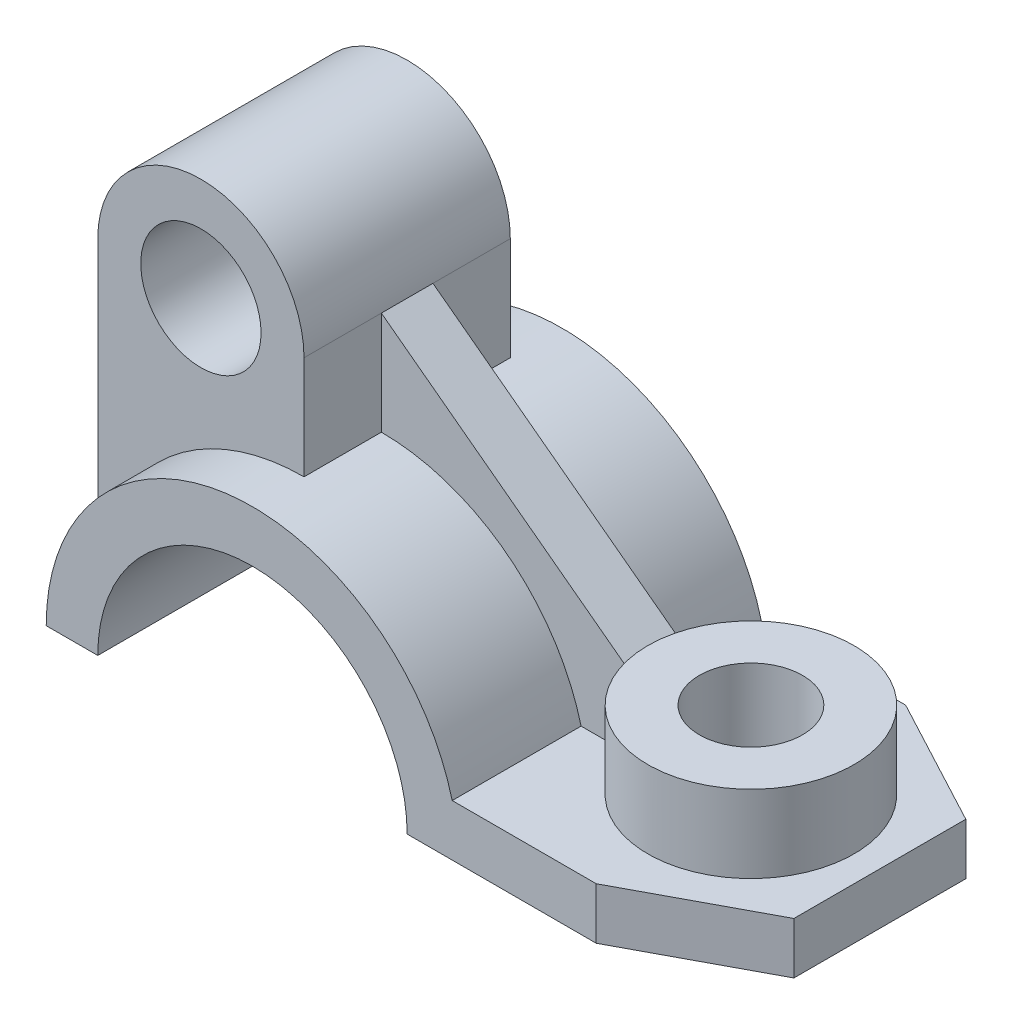
ISO-10303-21;
HEADER;
FILE_DESCRIPTION(('STEP AP214'),'2;1');
FILE_NAME('part.step','',(''),(''),'','','');
FILE_SCHEMA(('AUTOMOTIVE_DESIGN { 1 0 10303 214 1 1 1 1 }'));
ENDSEC;
DATA;
#1=APPLICATION_CONTEXT('core data for automotive mechanical design processes');
#2=APPLICATION_PROTOCOL_DEFINITION('international standard','automotive_design',2000,#1);
#3=PRODUCT_CONTEXT('',#1,'mechanical');
#4=PRODUCT('Part','Part','',(#3));
#5=PRODUCT_RELATED_PRODUCT_CATEGORY('part','',(#4));
#6=PRODUCT_DEFINITION_FORMATION('','',#4);
#7=PRODUCT_DEFINITION_CONTEXT('part definition',#1,'design');
#8=PRODUCT_DEFINITION('design','',#6,#7);
#9=PRODUCT_DEFINITION_SHAPE('','',#8);
#10=(LENGTH_UNIT() NAMED_UNIT(*) SI_UNIT(.MILLI.,.METRE.));
#11=(NAMED_UNIT(*) PLANE_ANGLE_UNIT() SI_UNIT($,.RADIAN.));
#12=(NAMED_UNIT(*) SI_UNIT($,.STERADIAN.) SOLID_ANGLE_UNIT());
#13=UNCERTAINTY_MEASURE_WITH_UNIT(LENGTH_MEASURE(1.E-05),#10,'distance_accuracy_value','');
#14=(GEOMETRIC_REPRESENTATION_CONTEXT(3) GLOBAL_UNCERTAINTY_ASSIGNED_CONTEXT((#13)) GLOBAL_UNIT_ASSIGNED_CONTEXT((#10,
#11,#12)) REPRESENTATION_CONTEXT('',''));
#15=CARTESIAN_POINT('',(0.,0.,0.));
#16=DIRECTION('',(0.,0.,1.));
#17=DIRECTION('',(1.,0.,0.));
#18=AXIS2_PLACEMENT_3D('',#15,#16,#17);
#19=CARTESIAN_POINT('',(0.,0.,18.));
#20=DIRECTION('',(0.,0.,-1.));
#21=DIRECTION('',(-1.,0.,0.));
#22=AXIS2_PLACEMENT_3D('',#19,#20,#21);
#23=CYLINDRICAL_SURFACE('',#22,24.);
#24=CARTESIAN_POINT('',(0.,0.,-3.));
#25=DIRECTION('',(0.,0.,1.));
#26=DIRECTION('',(1.,0.,0.));
#27=AXIS2_PLACEMENT_3D('',#24,#25,#26);
#28=CIRCLE('',#27,24.);
#29=CARTESIAN_POINT('',(23.2379000772445,5.99999999999999,-3.));
#30=VERTEX_POINT('',#29);
#31=CARTESIAN_POINT('',(0.,24.,-3.));
#32=VERTEX_POINT('',#31);
#33=EDGE_CURVE('E184',#30,#32,#28,.T.);
#34=ORIENTED_EDGE('',*,*,#33,.F.);
#35=DIRECTION('',(0.,0.,-1.));
#36=VECTOR('',#35,1.);
#37=CARTESIAN_POINT('',(23.2379000772445,5.99999999999999,18.));
#38=LINE('',#37,#36);
#39=CARTESIAN_POINT('',(23.2379000772445,5.99999999999999,-18.));
#40=VERTEX_POINT('',#39);
#41=EDGE_CURVE('E181',#30,#40,#38,.T.);
#42=ORIENTED_EDGE('',*,*,#41,.T.);
#43=CARTESIAN_POINT('',(0.,0.,-18.));
#44=DIRECTION('',(0.,0.,1.));
#45=DIRECTION('',(1.,0.,0.));
#46=AXIS2_PLACEMENT_3D('',#43,#44,#45);
#47=CIRCLE('',#46,24.);
#48=CARTESIAN_POINT('',(-24.,0.,-18.));
#49=VERTEX_POINT('',#48);
#50=EDGE_CURVE('E279',#40,#49,#47,.T.);
#51=ORIENTED_EDGE('',*,*,#50,.T.);
#52=DIRECTION('',(0.,0.,-1.));
#53=VECTOR('',#52,1.);
#54=CARTESIAN_POINT('',(-24.,0.,18.));
#55=LINE('',#54,#53);
#56=CARTESIAN_POINT('',(-24.,0.,-12.));
#57=VERTEX_POINT('',#56);
#58=EDGE_CURVE('E290',#57,#49,#55,.T.);
#59=ORIENTED_EDGE('',*,*,#58,.F.);
#60=CARTESIAN_POINT('',(0.,0.,-12.));
#61=DIRECTION('',(0.,0.,1.));
#62=DIRECTION('',(1.,0.,0.));
#63=AXIS2_PLACEMENT_3D('',#60,#61,#62);
#64=CIRCLE('',#63,24.);
#65=CARTESIAN_POINT('',(0.,24.,-12.));
#66=VERTEX_POINT('',#65);
#67=EDGE_CURVE('E246',#66,#57,#64,.T.);
#68=ORIENTED_EDGE('',*,*,#67,.F.);
#69=DIRECTION('',(0.,0.,-1.));
#70=VECTOR('',#69,1.);
#71=CARTESIAN_POINT('',(0.,24.,12.));
#72=LINE('',#71,#70);
#73=EDGE_CURVE('E254',#32,#66,#72,.T.);
#74=ORIENTED_EDGE('',*,*,#73,.F.);
#75=EDGE_LOOP('',(#34,#42,#51,#59,#68,#74));
#76=FACE_BOUND('',#75,.T.);
#77=ADVANCED_FACE('F43',(#76),#23,.T.);
#78=CARTESIAN_POINT('',(0.,0.,12.));
#79=DIRECTION('',(1.,0.,0.));
#80=DIRECTION('',(0.,1.,0.));
#81=AXIS2_PLACEMENT_3D('',#78,#79,#80);
#82=PLANE('',#81);
#83=DIRECTION('',(0.,0.,-1.));
#84=VECTOR('',#83,1.);
#85=CARTESIAN_POINT('',(0.,36.,12.));
#86=LINE('',#85,#84);
#87=CARTESIAN_POINT('',(0.,36.,-3.));
#88=VERTEX_POINT('',#87);
#89=CARTESIAN_POINT('',(0.,36.,-12.));
#90=VERTEX_POINT('',#89);
#91=EDGE_CURVE('E237',#88,#90,#86,.T.);
#92=ORIENTED_EDGE('',*,*,#91,.F.);
#93=DIRECTION('',(0.,-1.,0.));
#94=VECTOR('',#93,1.);
#95=CARTESIAN_POINT('',(0.,0.,-3.));
#96=LINE('',#95,#94);
#97=EDGE_CURVE('E198',#88,#32,#96,.T.);
#98=ORIENTED_EDGE('',*,*,#97,.T.);
#99=ORIENTED_EDGE('',*,*,#73,.T.);
#100=DIRECTION('',(0.,-1.,0.));
#101=VECTOR('',#100,1.);
#102=CARTESIAN_POINT('',(0.,0.,-12.));
#103=LINE('',#102,#101);
#104=EDGE_CURVE('E225',#90,#66,#103,.T.);
#105=ORIENTED_EDGE('',*,*,#104,.F.);
#106=EDGE_LOOP('',(#92,#98,#99,#105));
#107=FACE_BOUND('',#106,.T.);
#108=ADVANCED_FACE('F338',(#107),#82,.T.);
#109=CARTESIAN_POINT('',(0.,0.,18.));
#110=DIRECTION('',(0.,1.,0.));
#111=DIRECTION('',(0.,0.,1.));
#112=AXIS2_PLACEMENT_3D('',#109,#110,#111);
#113=PLANE('',#112);
#114=CARTESIAN_POINT('',(40.,0.,0.));
#115=DIRECTION('',(0.,1.,0.));
#116=DIRECTION('',(-1.,0.,0.));
#117=AXIS2_PLACEMENT_3D('',#114,#115,#116);
#118=CIRCLE('',#117,6.);
#119=CARTESIAN_POINT('',(34.,0.,0.));
#120=VERTEX_POINT('',#119);
#121=EDGE_CURVE('E376',#120,#120,#118,.T.);
#122=ORIENTED_EDGE('',*,*,#121,.T.);
#123=EDGE_LOOP('',(#122));
#124=FACE_BOUND('',#123,.T.);
#125=DIRECTION('',(1.,0.,0.));
#126=VECTOR('',#125,1.);
#127=CARTESIAN_POINT('',(0.,0.,-18.));
#128=LINE('',#127,#126);
#129=CARTESIAN_POINT('',(18.,0.,-18.));
#130=VERTEX_POINT('',#129);
#131=CARTESIAN_POINT('',(39.9999999999999,0.,-18.));
#132=VERTEX_POINT('',#131);
#133=EDGE_CURVE('E262',#130,#132,#128,.T.);
#134=ORIENTED_EDGE('',*,*,#133,.T.);
#135=DIRECTION('',(-0.882352941176472,0.,-0.470588235294116));
#136=VECTOR('',#135,1.);
#137=CARTESIAN_POINT('',(55.,0.,-9.99999999999999));
#138=LINE('',#137,#136);
#139=CARTESIAN_POINT('',(55.,0.,-9.99999999999999));
#140=VERTEX_POINT('',#139);
#141=EDGE_CURVE('E11',#132,#140,#138,.F.);
#142=ORIENTED_EDGE('',*,*,#141,.T.);
#143=DIRECTION('',(0.,0.,-1.));
#144=VECTOR('',#143,1.);
#145=CARTESIAN_POINT('',(55.,0.,18.));
#146=LINE('',#145,#144);
#147=CARTESIAN_POINT('',(55.,0.,9.99999999999999));
#148=VERTEX_POINT('',#147);
#149=EDGE_CURVE('E174',#148,#140,#146,.T.);
#150=ORIENTED_EDGE('',*,*,#149,.F.);
#151=DIRECTION('',(-0.882352941176472,0.,0.470588235294116));
#152=VECTOR('',#151,1.);
#153=CARTESIAN_POINT('',(39.9999999999999,0.,18.));
#154=LINE('',#153,#152);
#155=CARTESIAN_POINT('',(39.9999999999999,0.,18.));
#156=VERTEX_POINT('',#155);
#157=EDGE_CURVE('E307',#148,#156,#154,.T.);
#158=ORIENTED_EDGE('',*,*,#157,.T.);
#159=DIRECTION('',(1.,0.,0.));
#160=VECTOR('',#159,1.);
#161=CARTESIAN_POINT('',(0.,0.,18.));
#162=LINE('',#161,#160);
#163=CARTESIAN_POINT('',(18.,0.,18.));
#164=VERTEX_POINT('',#163);
#165=EDGE_CURVE('E263',#164,#156,#162,.T.);
#166=ORIENTED_EDGE('',*,*,#165,.F.);
#167=DIRECTION('',(0.,0.,-1.));
#168=VECTOR('',#167,1.);
#169=CARTESIAN_POINT('',(18.,0.,18.));
#170=LINE('',#169,#168);
#171=EDGE_CURVE('E275',#164,#130,#170,.T.);
#172=ORIENTED_EDGE('',*,*,#171,.T.);
#173=EDGE_LOOP('',(#134,#142,#150,#158,#166,#172));
#174=FACE_BOUND('',#173,.T.);
#175=ADVANCED_FACE('F332',(#124,#174),#113,.F.);
#176=CARTESIAN_POINT('',(55.,0.,18.));
#177=DIRECTION('',(-1.,0.,0.));
#178=DIRECTION('',(0.,0.,1.));
#179=AXIS2_PLACEMENT_3D('',#176,#177,#178);
#180=PLANE('',#179);
#181=ORIENTED_EDGE('',*,*,#149,.T.);
#182=DIRECTION('',(0.,1.,0.));
#183=VECTOR('',#182,1.);
#184=CARTESIAN_POINT('',(55.,0.,-9.99999999999999));
#185=LINE('',#184,#183);
#186=CARTESIAN_POINT('',(55.,6.,-9.99999999999999));
#187=VERTEX_POINT('',#186);
#188=EDGE_CURVE('E309',#140,#187,#185,.T.);
#189=ORIENTED_EDGE('',*,*,#188,.T.);
#190=DIRECTION('',(0.,0.,-1.));
#191=VECTOR('',#190,1.);
#192=CARTESIAN_POINT('',(55.,6.,18.));
#193=LINE('',#192,#191);
#194=CARTESIAN_POINT('',(55.,6.,9.99999999999999));
#195=VERTEX_POINT('',#194);
#196=EDGE_CURVE('E297',#195,#187,#193,.T.);
#197=ORIENTED_EDGE('',*,*,#196,.F.);
#198=DIRECTION('',(0.,-1.,0.));
#199=VECTOR('',#198,1.);
#200=CARTESIAN_POINT('',(55.,0.,9.99999999999999));
#201=LINE('',#200,#199);
#202=EDGE_CURVE('E305',#195,#148,#201,.T.);
#203=ORIENTED_EDGE('',*,*,#202,.T.);
#204=EDGE_LOOP('',(#181,#189,#197,#203));
#205=FACE_BOUND('',#204,.T.);
#206=ADVANCED_FACE('F315',(#205),#180,.F.);
#207=CARTESIAN_POINT('',(0.,5.99999999999999,18.));
#208=DIRECTION('',(0.,-1.,0.));
#209=DIRECTION('',(1.,0.,0.));
#210=AXIS2_PLACEMENT_3D('',#207,#208,#209);
#211=PLANE('',#210);
#212=ORIENTED_EDGE('',*,*,#196,.T.);
#213=DIRECTION('',(0.882352941176472,0.,0.470588235294116));
#214=VECTOR('',#213,1.);
#215=CARTESIAN_POINT('',(55.,6.,-9.99999999999999));
#216=LINE('',#215,#214);
#217=CARTESIAN_POINT('',(39.9999999999999,6.,-18.));
#218=VERTEX_POINT('',#217);
#219=EDGE_CURVE('E66',#187,#218,#216,.F.);
#220=ORIENTED_EDGE('',*,*,#219,.T.);
#221=DIRECTION('',(-1.,0.,0.));
#222=VECTOR('',#221,1.);
#223=CARTESIAN_POINT('',(0.,5.99999999999999,-18.));
#224=LINE('',#223,#222);
#225=EDGE_CURVE('E277',#218,#40,#224,.T.);
#226=ORIENTED_EDGE('',*,*,#225,.T.);
#227=ORIENTED_EDGE('',*,*,#41,.F.);
#228=DIRECTION('',(-1.,0.,0.));
#229=VECTOR('',#228,1.);
#230=CARTESIAN_POINT('',(0.,5.99999999999999,-3.));
#231=LINE('',#230,#229);
#232=CARTESIAN_POINT('',(28.3810499613778,6.,-3.));
#233=VERTEX_POINT('',#232);
#234=EDGE_CURVE('E178',#233,#30,#231,.T.);
#235=ORIENTED_EDGE('',*,*,#234,.F.);
#236=CARTESIAN_POINT('',(40.,6.,0.));
#237=DIRECTION('',(0.,-1.,0.));
#238=DIRECTION('',(1.,0.,0.));
#239=AXIS2_PLACEMENT_3D('',#236,#237,#238);
#240=CIRCLE('',#239,12.);
#241=CARTESIAN_POINT('',(28.3810499613778,6.,3.));
#242=VERTEX_POINT('',#241);
#243=EDGE_CURVE('E164',#242,#233,#240,.F.);
#244=ORIENTED_EDGE('',*,*,#243,.F.);
#245=DIRECTION('',(-1.,0.,0.));
#246=VECTOR('',#245,1.);
#247=CARTESIAN_POINT('',(0.,5.99999999999999,3.));
#248=LINE('',#247,#246);
#249=CARTESIAN_POINT('',(23.2379000772445,5.99999999999999,3.));
#250=VERTEX_POINT('',#249);
#251=EDGE_CURVE('E201',#242,#250,#248,.T.);
#252=ORIENTED_EDGE('',*,*,#251,.T.);
#253=CARTESIAN_POINT('',(23.2379000772445,5.99999999999999,18.));
#254=VERTEX_POINT('',#253);
#255=EDGE_CURVE('E294',#254,#250,#38,.T.);
#256=ORIENTED_EDGE('',*,*,#255,.F.);
#257=DIRECTION('',(-1.,0.,0.));
#258=VECTOR('',#257,1.);
#259=CARTESIAN_POINT('',(0.,5.99999999999999,18.));
#260=LINE('',#259,#258);
#261=CARTESIAN_POINT('',(39.9999999999999,6.,18.));
#262=VERTEX_POINT('',#261);
#263=EDGE_CURVE('E266',#262,#254,#260,.T.);
#264=ORIENTED_EDGE('',*,*,#263,.F.);
#265=DIRECTION('',(0.882352941176472,0.,-0.470588235294116));
#266=VECTOR('',#265,1.);
#267=CARTESIAN_POINT('',(39.9999999999999,6.,18.));
#268=LINE('',#267,#266);
#269=EDGE_CURVE('E303',#262,#195,#268,.T.);
#270=ORIENTED_EDGE('',*,*,#269,.T.);
#271=EDGE_LOOP('',(#212,#220,#226,#227,#235,#244,#252,#256,#264,#270));
#272=FACE_BOUND('',#271,.T.);
#273=ADVANCED_FACE('F179',(#272),#211,.F.);
#274=ORIENTED_EDGE('',*,*,#255,.T.);
#275=CARTESIAN_POINT('',(0.,0.,3.));
#276=DIRECTION('',(0.,0.,1.));
#277=DIRECTION('',(1.,0.,0.));
#278=AXIS2_PLACEMENT_3D('',#275,#276,#277);
#279=CIRCLE('',#278,24.);
#280=CARTESIAN_POINT('',(0.,24.,3.));
#281=VERTEX_POINT('',#280);
#282=EDGE_CURVE('E203',#250,#281,#279,.T.);
#283=ORIENTED_EDGE('',*,*,#282,.T.);
#284=CARTESIAN_POINT('',(0.,24.,12.));
#285=VERTEX_POINT('',#284);
#286=EDGE_CURVE('E255',#285,#281,#72,.T.);
#287=ORIENTED_EDGE('',*,*,#286,.F.);
#288=CARTESIAN_POINT('',(0.,0.,12.));
#289=DIRECTION('',(0.,0.,1.));
#290=DIRECTION('',(1.,0.,0.));
#291=AXIS2_PLACEMENT_3D('',#288,#289,#290);
#292=CIRCLE('',#291,24.);
#293=CARTESIAN_POINT('',(-24.,0.,12.));
#294=VERTEX_POINT('',#293);
#295=EDGE_CURVE('E231',#285,#294,#292,.T.);
#296=ORIENTED_EDGE('',*,*,#295,.T.);
#297=CARTESIAN_POINT('',(-24.,0.,18.));
#298=VERTEX_POINT('',#297);
#299=EDGE_CURVE('E291',#298,#294,#55,.T.);
#300=ORIENTED_EDGE('',*,*,#299,.F.);
#301=CARTESIAN_POINT('',(0.,0.,18.));
#302=DIRECTION('',(0.,0.,1.));
#303=DIRECTION('',(1.,0.,0.));
#304=AXIS2_PLACEMENT_3D('',#301,#302,#303);
#305=CIRCLE('',#304,24.);
#306=EDGE_CURVE('E269',#254,#298,#305,.T.);
#307=ORIENTED_EDGE('',*,*,#306,.F.);
#308=EDGE_LOOP('',(#274,#283,#287,#296,#300,#307));
#309=FACE_BOUND('',#308,.T.);
#310=ADVANCED_FACE('F341',(#309),#23,.T.);
#311=CARTESIAN_POINT('',(0.,0.,18.));
#312=DIRECTION('',(0.,1.,0.));
#313=DIRECTION('',(0.,0.,1.));
#314=AXIS2_PLACEMENT_3D('',#311,#312,#313);
#315=PLANE('',#314);
#316=DIRECTION('',(0.,0.,-1.));
#317=VECTOR('',#316,1.);
#318=CARTESIAN_POINT('',(-24.,0.,12.));
#319=LINE('',#318,#317);
#320=EDGE_CURVE('E258',#294,#57,#319,.T.);
#321=ORIENTED_EDGE('',*,*,#320,.T.);
#322=ORIENTED_EDGE('',*,*,#58,.T.);
#323=DIRECTION('',(1.,0.,0.));
#324=VECTOR('',#323,1.);
#325=CARTESIAN_POINT('',(0.,0.,-18.));
#326=LINE('',#325,#324);
#327=CARTESIAN_POINT('',(-18.,0.,-18.));
#328=VERTEX_POINT('',#327);
#329=EDGE_CURVE('E282',#49,#328,#326,.T.);
#330=ORIENTED_EDGE('',*,*,#329,.T.);
#331=DIRECTION('',(0.,0.,-1.));
#332=VECTOR('',#331,1.);
#333=CARTESIAN_POINT('',(-18.,0.,18.));
#334=LINE('',#333,#332);
#335=CARTESIAN_POINT('',(-18.,0.,18.));
#336=VERTEX_POINT('',#335);
#337=EDGE_CURVE('E288',#336,#328,#334,.T.);
#338=ORIENTED_EDGE('',*,*,#337,.F.);
#339=DIRECTION('',(1.,0.,0.));
#340=VECTOR('',#339,1.);
#341=CARTESIAN_POINT('',(0.,0.,18.));
#342=LINE('',#341,#340);
#343=EDGE_CURVE('E271',#298,#336,#342,.T.);
#344=ORIENTED_EDGE('',*,*,#343,.F.);
#345=ORIENTED_EDGE('',*,*,#299,.T.);
#346=EDGE_LOOP('',(#321,#322,#330,#338,#344,#345));
#347=FACE_BOUND('',#346,.T.);
#348=ADVANCED_FACE('F351',(#347),#315,.F.);
#349=CARTESIAN_POINT('',(0.,0.,18.));
#350=DIRECTION('',(0.,0.,-1.));
#351=DIRECTION('',(-1.,0.,0.));
#352=AXIS2_PLACEMENT_3D('',#349,#350,#351);
#353=CYLINDRICAL_SURFACE('',#352,18.);
#354=ORIENTED_EDGE('',*,*,#337,.T.);
#355=CARTESIAN_POINT('',(0.,0.,-18.));
#356=DIRECTION('',(0.,0.,1.));
#357=DIRECTION('',(1.,0.,0.));
#358=AXIS2_PLACEMENT_3D('',#355,#356,#357);
#359=CIRCLE('',#358,18.);
#360=EDGE_CURVE('E267',#328,#130,#359,.F.);
#361=ORIENTED_EDGE('',*,*,#360,.T.);
#362=ORIENTED_EDGE('',*,*,#171,.F.);
#363=CARTESIAN_POINT('',(0.,0.,18.));
#364=DIRECTION('',(0.,0.,1.));
#365=DIRECTION('',(1.,0.,0.));
#366=AXIS2_PLACEMENT_3D('',#363,#364,#365);
#367=CIRCLE('',#366,18.);
#368=EDGE_CURVE('E273',#336,#164,#367,.F.);
#369=ORIENTED_EDGE('',*,*,#368,.F.);
#370=EDGE_LOOP('',(#354,#361,#362,#369));
#371=FACE_BOUND('',#370,.T.);
#372=ADVANCED_FACE('F357',(#371),#353,.F.);
#373=CARTESIAN_POINT('',(0.,0.,18.));
#374=DIRECTION('',(0.,0.,1.));
#375=DIRECTION('',(1.,0.,0.));
#376=AXIS2_PLACEMENT_3D('',#373,#374,#375);
#377=PLANE('',#376);
#378=ORIENTED_EDGE('',*,*,#165,.T.);
#379=DIRECTION('',(0.,1.,0.));
#380=VECTOR('',#379,1.);
#381=CARTESIAN_POINT('',(39.9999999999999,6.,18.));
#382=LINE('',#381,#380);
#383=EDGE_CURVE('E173',#156,#262,#382,.T.);
#384=ORIENTED_EDGE('',*,*,#383,.T.);
#385=ORIENTED_EDGE('',*,*,#263,.T.);
#386=ORIENTED_EDGE('',*,*,#306,.T.);
#387=ORIENTED_EDGE('',*,*,#343,.T.);
#388=ORIENTED_EDGE('',*,*,#368,.T.);
#389=EDGE_LOOP('',(#378,#384,#385,#386,#387,#388));
#390=FACE_BOUND('',#389,.T.);
#391=ADVANCED_FACE('F327',(#390),#377,.T.);
#392=CARTESIAN_POINT('',(0.,0.,-18.));
#393=DIRECTION('',(0.,0.,1.));
#394=DIRECTION('',(1.,0.,0.));
#395=AXIS2_PLACEMENT_3D('',#392,#393,#394);
#396=PLANE('',#395);
#397=ORIENTED_EDGE('',*,*,#225,.F.);
#398=DIRECTION('',(0.,-1.,0.));
#399=VECTOR('',#398,1.);
#400=CARTESIAN_POINT('',(39.9999999999999,0.,-18.));
#401=LINE('',#400,#399);
#402=EDGE_CURVE('E52',#218,#132,#401,.T.);
#403=ORIENTED_EDGE('',*,*,#402,.T.);
#404=ORIENTED_EDGE('',*,*,#133,.F.);
#405=ORIENTED_EDGE('',*,*,#360,.F.);
#406=ORIENTED_EDGE('',*,*,#329,.F.);
#407=ORIENTED_EDGE('',*,*,#50,.F.);
#408=EDGE_LOOP('',(#397,#403,#404,#405,#406,#407));
#409=FACE_BOUND('',#408,.T.);
#410=ADVANCED_FACE('F414',(#409),#396,.F.);
#411=CARTESIAN_POINT('',(-12.,36.,12.));
#412=DIRECTION('',(0.,0.,-1.));
#413=DIRECTION('',(-1.,0.,0.));
#414=AXIS2_PLACEMENT_3D('',#411,#412,#413);
#415=CYLINDRICAL_SURFACE('',#414,12.);
#416=CARTESIAN_POINT('',(-12.,36.,-12.));
#417=DIRECTION('',(0.,0.,1.));
#418=DIRECTION('',(1.,0.,0.));
#419=AXIS2_PLACEMENT_3D('',#416,#417,#418);
#420=CIRCLE('',#419,12.);
#421=CARTESIAN_POINT('',(-24.,36.,-12.));
#422=VERTEX_POINT('',#421);
#423=EDGE_CURVE('E240',#422,#90,#420,.F.);
#424=ORIENTED_EDGE('',*,*,#423,.F.);
#425=DIRECTION('',(0.,0.,-1.));
#426=VECTOR('',#425,1.);
#427=CARTESIAN_POINT('',(-24.,36.,12.));
#428=LINE('',#427,#426);
#429=CARTESIAN_POINT('',(-24.,36.,12.));
#430=VERTEX_POINT('',#429);
#431=EDGE_CURVE('E260',#430,#422,#428,.T.);
#432=ORIENTED_EDGE('',*,*,#431,.F.);
#433=CARTESIAN_POINT('',(-12.,36.,12.));
#434=DIRECTION('',(0.,0.,1.));
#435=DIRECTION('',(1.,0.,0.));
#436=AXIS2_PLACEMENT_3D('',#433,#434,#435);
#437=CIRCLE('',#436,12.);
#438=CARTESIAN_POINT('',(0.,36.,12.));
#439=VERTEX_POINT('',#438);
#440=EDGE_CURVE('E224',#430,#439,#437,.F.);
#441=ORIENTED_EDGE('',*,*,#440,.T.);
#442=CARTESIAN_POINT('',(0.,36.,3.));
#443=VERTEX_POINT('',#442);
#444=EDGE_CURVE('E251',#439,#443,#86,.T.);
#445=ORIENTED_EDGE('',*,*,#444,.T.);
#446=DIRECTION('',(0.,0.,-1.));
#447=VECTOR('',#446,1.);
#448=CARTESIAN_POINT('',(0.,36.,12.));
#449=LINE('',#448,#447);
#450=EDGE_CURVE('E211',#88,#443,#449,.F.);
#451=ORIENTED_EDGE('',*,*,#450,.F.);
#452=ORIENTED_EDGE('',*,*,#91,.T.);
#453=EDGE_LOOP('',(#424,#432,#441,#445,#451,#452));
#454=FACE_BOUND('',#453,.T.);
#455=ADVANCED_FACE('F370',(#454),#415,.T.);
#456=CARTESIAN_POINT('',(-24.,0.,12.));
#457=DIRECTION('',(-1.,0.,0.));
#458=DIRECTION('',(0.,0.,1.));
#459=AXIS2_PLACEMENT_3D('',#456,#457,#458);
#460=PLANE('',#459);
#461=ORIENTED_EDGE('',*,*,#431,.T.);
#462=DIRECTION('',(0.,1.,0.));
#463=VECTOR('',#462,1.);
#464=CARTESIAN_POINT('',(-24.,0.,-12.));
#465=LINE('',#464,#463);
#466=EDGE_CURVE('E243',#57,#422,#465,.T.);
#467=ORIENTED_EDGE('',*,*,#466,.F.);
#468=ORIENTED_EDGE('',*,*,#320,.F.);
#469=DIRECTION('',(0.,1.,0.));
#470=VECTOR('',#469,1.);
#471=CARTESIAN_POINT('',(-24.,0.,12.));
#472=LINE('',#471,#470);
#473=EDGE_CURVE('E228',#294,#430,#472,.T.);
#474=ORIENTED_EDGE('',*,*,#473,.T.);
#475=EDGE_LOOP('',(#461,#467,#468,#474));
#476=FACE_BOUND('',#475,.T.);
#477=ADVANCED_FACE('F408',(#476),#460,.T.);
#478=CARTESIAN_POINT('',(-12.,36.,12.));
#479=DIRECTION('',(0.,0.,-1.));
#480=DIRECTION('',(-1.,0.,0.));
#481=AXIS2_PLACEMENT_3D('',#478,#479,#480);
#482=CYLINDRICAL_SURFACE('',#481,7.);
#483=CARTESIAN_POINT('',(-12.,36.,12.));
#484=DIRECTION('',(0.,0.,1.));
#485=DIRECTION('',(1.,0.,0.));
#486=AXIS2_PLACEMENT_3D('',#483,#484,#485);
#487=CIRCLE('',#486,7.);
#488=CARTESIAN_POINT('',(-5.,36.,12.));
#489=VERTEX_POINT('',#488);
#490=EDGE_CURVE('E221',#489,#489,#487,.T.);
#491=ORIENTED_EDGE('',*,*,#490,.T.);
#492=EDGE_LOOP('',(#491));
#493=FACE_BOUND('',#492,.T.);
#494=CARTESIAN_POINT('',(-12.,36.,-12.));
#495=DIRECTION('',(0.,0.,1.));
#496=DIRECTION('',(1.,0.,0.));
#497=AXIS2_PLACEMENT_3D('',#494,#495,#496);
#498=CIRCLE('',#497,7.);
#499=CARTESIAN_POINT('',(-5.,36.,-12.));
#500=VERTEX_POINT('',#499);
#501=EDGE_CURVE('E220',#500,#500,#498,.T.);
#502=ORIENTED_EDGE('',*,*,#501,.F.);
#503=EDGE_LOOP('',(#502));
#504=FACE_BOUND('',#503,.T.);
#505=ADVANCED_FACE('F407',(#493,#504),#482,.F.);
#506=DIRECTION('',(0.,-1.,0.));
#507=VECTOR('',#506,1.);
#508=CARTESIAN_POINT('',(0.,0.,3.));
#509=LINE('',#508,#507);
#510=EDGE_CURVE('E205',#443,#281,#509,.T.);
#511=ORIENTED_EDGE('',*,*,#510,.F.);
#512=ORIENTED_EDGE('',*,*,#444,.F.);
#513=DIRECTION('',(0.,-1.,0.));
#514=VECTOR('',#513,1.);
#515=CARTESIAN_POINT('',(0.,0.,12.));
#516=LINE('',#515,#514);
#517=EDGE_CURVE('E234',#439,#285,#516,.T.);
#518=ORIENTED_EDGE('',*,*,#517,.T.);
#519=ORIENTED_EDGE('',*,*,#286,.T.);
#520=EDGE_LOOP('',(#511,#512,#518,#519));
#521=FACE_BOUND('',#520,.T.);
#522=ADVANCED_FACE('F347',(#521),#82,.T.);
#523=CARTESIAN_POINT('',(0.,0.,12.));
#524=DIRECTION('',(0.,0.,1.));
#525=DIRECTION('',(1.,0.,0.));
#526=AXIS2_PLACEMENT_3D('',#523,#524,#525);
#527=PLANE('',#526);
#528=ORIENTED_EDGE('',*,*,#490,.F.);
#529=EDGE_LOOP('',(#528));
#530=FACE_BOUND('',#529,.T.);
#531=ORIENTED_EDGE('',*,*,#440,.F.);
#532=ORIENTED_EDGE('',*,*,#473,.F.);
#533=ORIENTED_EDGE('',*,*,#295,.F.);
#534=ORIENTED_EDGE('',*,*,#517,.F.);
#535=EDGE_LOOP('',(#531,#532,#533,#534));
#536=FACE_BOUND('',#535,.T.);
#537=ADVANCED_FACE('F399',(#530,#536),#527,.T.);
#538=CARTESIAN_POINT('',(0.,0.,-12.));
#539=DIRECTION('',(0.,0.,1.));
#540=DIRECTION('',(1.,0.,0.));
#541=AXIS2_PLACEMENT_3D('',#538,#539,#540);
#542=PLANE('',#541);
#543=ORIENTED_EDGE('',*,*,#501,.T.);
#544=EDGE_LOOP('',(#543));
#545=FACE_BOUND('',#544,.T.);
#546=ORIENTED_EDGE('',*,*,#423,.T.);
#547=ORIENTED_EDGE('',*,*,#104,.T.);
#548=ORIENTED_EDGE('',*,*,#67,.T.);
#549=ORIENTED_EDGE('',*,*,#466,.T.);
#550=EDGE_LOOP('',(#546,#547,#548,#549));
#551=FACE_BOUND('',#550,.T.);
#552=ADVANCED_FACE('F396',(#545,#551),#542,.F.);
#553=CARTESIAN_POINT('',(40.,15.,0.));
#554=DIRECTION('',(0.,1.,0.));
#555=DIRECTION('',(-1.,0.,0.));
#556=AXIS2_PLACEMENT_3D('',#553,#554,#555);
#557=PLANE('',#556);
#558=CARTESIAN_POINT('',(40.,15.,0.));
#559=DIRECTION('',(0.,1.,0.));
#560=DIRECTION('',(-1.,0.,0.));
#561=AXIS2_PLACEMENT_3D('',#558,#559,#560);
#562=CIRCLE('',#561,12.);
#563=CARTESIAN_POINT('',(28.,15.,0.));
#564=VERTEX_POINT('',#563);
#565=EDGE_CURVE('E217',#564,#564,#562,.T.);
#566=ORIENTED_EDGE('',*,*,#565,.T.);
#567=EDGE_LOOP('',(#566));
#568=FACE_BOUND('',#567,.T.);
#569=CARTESIAN_POINT('',(40.,15.,0.));
#570=DIRECTION('',(0.,1.,0.));
#571=DIRECTION('',(-1.,0.,0.));
#572=AXIS2_PLACEMENT_3D('',#569,#570,#571);
#573=CIRCLE('',#572,6.);
#574=CARTESIAN_POINT('',(34.,15.,0.));
#575=VERTEX_POINT('',#574);
#576=EDGE_CURVE('E214',#575,#575,#573,.T.);
#577=ORIENTED_EDGE('',*,*,#576,.F.);
#578=EDGE_LOOP('',(#577));
#579=FACE_BOUND('',#578,.T.);
#580=ADVANCED_FACE('F391',(#568,#579),#557,.T.);
#581=CARTESIAN_POINT('',(40.,15.,0.));
#582=DIRECTION('',(0.,-1.,0.));
#583=DIRECTION('',(1.,0.,0.));
#584=AXIS2_PLACEMENT_3D('',#581,#582,#583);
#585=CYLINDRICAL_SURFACE('',#584,12.);
#586=CARTESIAN_POINT('',(40.,5.99999999999999,0.));
#587=DIRECTION('',(-0.6,-0.8,0.));
#588=DIRECTION('',(0.8,-0.6,0.));
#589=AXIS2_PLACEMENT_3D('',#586,#587,#588);
#590=ELLIPSE('',#589,15.,12.);
#591=CARTESIAN_POINT('',(28.3810499613778,14.7142125289667,3.));
#592=VERTEX_POINT('',#591);
#593=EDGE_CURVE('E208',#564,#592,#590,.F.);
#594=ORIENTED_EDGE('',*,*,#593,.T.);
#595=DIRECTION('',(0.,-1.,0.));
#596=VECTOR('',#595,1.);
#597=CARTESIAN_POINT('',(28.3810499613778,15.,3.));
#598=LINE('',#597,#596);
#599=EDGE_CURVE('E171',#592,#242,#598,.T.);
#600=ORIENTED_EDGE('',*,*,#599,.T.);
#601=ORIENTED_EDGE('',*,*,#243,.T.);
#602=DIRECTION('',(0.,-1.,0.));
#603=VECTOR('',#602,1.);
#604=CARTESIAN_POINT('',(28.3810499613778,15.,-3.));
#605=LINE('',#604,#603);
#606=CARTESIAN_POINT('',(28.3810499613778,14.7142125289667,-3.));
#607=VERTEX_POINT('',#606);
#608=EDGE_CURVE('E168',#607,#233,#605,.T.);
#609=ORIENTED_EDGE('',*,*,#608,.F.);
#610=EDGE_CURVE('E210',#607,#564,#590,.F.);
#611=ORIENTED_EDGE('',*,*,#610,.T.);
#612=ORIENTED_EDGE('',*,*,#565,.F.);
#613=EDGE_LOOP('',(#594,#600,#601,#609,#611,#612));
#614=FACE_BOUND('',#613,.T.);
#615=ADVANCED_FACE('F166',(#614),#585,.T.);
#616=CARTESIAN_POINT('',(40.,15.,0.));
#617=DIRECTION('',(0.,-1.,0.));
#618=DIRECTION('',(1.,0.,0.));
#619=AXIS2_PLACEMENT_3D('',#616,#617,#618);
#620=CYLINDRICAL_SURFACE('',#619,6.);
#621=ORIENTED_EDGE('',*,*,#576,.T.);
#622=EDGE_LOOP('',(#621));
#623=FACE_BOUND('',#622,.T.);
#624=ORIENTED_EDGE('',*,*,#121,.F.);
#625=EDGE_LOOP('',(#624));
#626=FACE_BOUND('',#625,.T.);
#627=ADVANCED_FACE('F382',(#623,#626),#620,.F.);
#628=CARTESIAN_POINT('',(0.,36.,0.));
#629=DIRECTION('',(-0.6,-0.8,0.));
#630=DIRECTION('',(0.8,-0.6,0.));
#631=AXIS2_PLACEMENT_3D('',#628,#629,#630);
#632=PLANE('',#631);
#633=DIRECTION('',(0.8,-0.6,0.));
#634=VECTOR('',#633,1.);
#635=CARTESIAN_POINT('',(0.,36.,-3.));
#636=LINE('',#635,#634);
#637=EDGE_CURVE('E190',#88,#607,#636,.T.);
#638=ORIENTED_EDGE('',*,*,#637,.F.);
#639=ORIENTED_EDGE('',*,*,#450,.T.);
#640=DIRECTION('',(0.8,-0.6,0.));
#641=VECTOR('',#640,1.);
#642=CARTESIAN_POINT('',(0.,36.,3.));
#643=LINE('',#642,#641);
#644=EDGE_CURVE('E191',#443,#592,#643,.T.);
#645=ORIENTED_EDGE('',*,*,#644,.T.);
#646=ORIENTED_EDGE('',*,*,#593,.F.);
#647=ORIENTED_EDGE('',*,*,#610,.F.);
#648=EDGE_LOOP('',(#638,#639,#645,#646,#647));
#649=FACE_BOUND('',#648,.T.);
#650=ADVANCED_FACE('F374',(#649),#632,.F.);
#651=CARTESIAN_POINT('',(15.5,24.,3.));
#652=DIRECTION('',(0.,0.,1.));
#653=DIRECTION('',(1.,0.,0.));
#654=AXIS2_PLACEMENT_3D('',#651,#652,#653);
#655=PLANE('',#654);
#656=ORIENTED_EDGE('',*,*,#644,.F.);
#657=ORIENTED_EDGE('',*,*,#510,.T.);
#658=ORIENTED_EDGE('',*,*,#282,.F.);
#659=ORIENTED_EDGE('',*,*,#251,.F.);
#660=ORIENTED_EDGE('',*,*,#599,.F.);
#661=EDGE_LOOP('',(#656,#657,#658,#659,#660));
#662=FACE_BOUND('',#661,.T.);
#663=ADVANCED_FACE('F365',(#662),#655,.T.);
#664=CARTESIAN_POINT('',(15.5,24.,-3.));
#665=DIRECTION('',(0.,0.,1.));
#666=DIRECTION('',(1.,0.,0.));
#667=AXIS2_PLACEMENT_3D('',#664,#665,#666);
#668=PLANE('',#667);
#669=ORIENTED_EDGE('',*,*,#97,.F.);
#670=ORIENTED_EDGE('',*,*,#637,.T.);
#671=ORIENTED_EDGE('',*,*,#608,.T.);
#672=ORIENTED_EDGE('',*,*,#234,.T.);
#673=ORIENTED_EDGE('',*,*,#33,.T.);
#674=EDGE_LOOP('',(#669,#670,#671,#672,#673));
#675=FACE_BOUND('',#674,.T.);
#676=ADVANCED_FACE('F188',(#675),#668,.F.);
#677=CARTESIAN_POINT('',(39.9999999999999,0.,18.));
#678=DIRECTION('',(0.470588235294116,0.,0.882352941176472));
#679=DIRECTION('',(0.,-1.,0.));
#680=AXIS2_PLACEMENT_3D('',#677,#678,#679);
#681=PLANE('',#680);
#682=ORIENTED_EDGE('',*,*,#157,.F.);
#683=ORIENTED_EDGE('',*,*,#202,.F.);
#684=ORIENTED_EDGE('',*,*,#269,.F.);
#685=ORIENTED_EDGE('',*,*,#383,.F.);
#686=EDGE_LOOP('',(#682,#683,#684,#685));
#687=FACE_BOUND('',#686,.T.);
#688=ADVANCED_FACE('F325',(#687),#681,.T.);
#689=CARTESIAN_POINT('',(55.,0.,-9.99999999999999));
#690=DIRECTION('',(-0.470588235294116,0.,0.882352941176472));
#691=DIRECTION('',(0.,1.,0.));
#692=AXIS2_PLACEMENT_3D('',#689,#690,#691);
#693=PLANE('',#692);
#694=ORIENTED_EDGE('',*,*,#141,.F.);
#695=ORIENTED_EDGE('',*,*,#402,.F.);
#696=ORIENTED_EDGE('',*,*,#219,.F.);
#697=ORIENTED_EDGE('',*,*,#188,.F.);
#698=EDGE_LOOP('',(#694,#695,#696,#697));
#699=FACE_BOUND('',#698,.T.);
#700=ADVANCED_FACE('F46',(#699),#693,.F.);
#701=CLOSED_SHELL('',(#77,#108,#175,#206,#273,#310,#348,#372,#391,#410,#455,#477,#505,#522,#537,
#552,#580,#615,#627,#650,#663,#676,#688,#700));
#702=MANIFOLD_SOLID_BREP('B2',#701);
#703=ADVANCED_BREP_SHAPE_REPRESENTATION('',(#18,#702),#14);
#704=SHAPE_DEFINITION_REPRESENTATION(#9,#703);
ENDSEC;
END-ISO-10303-21;
